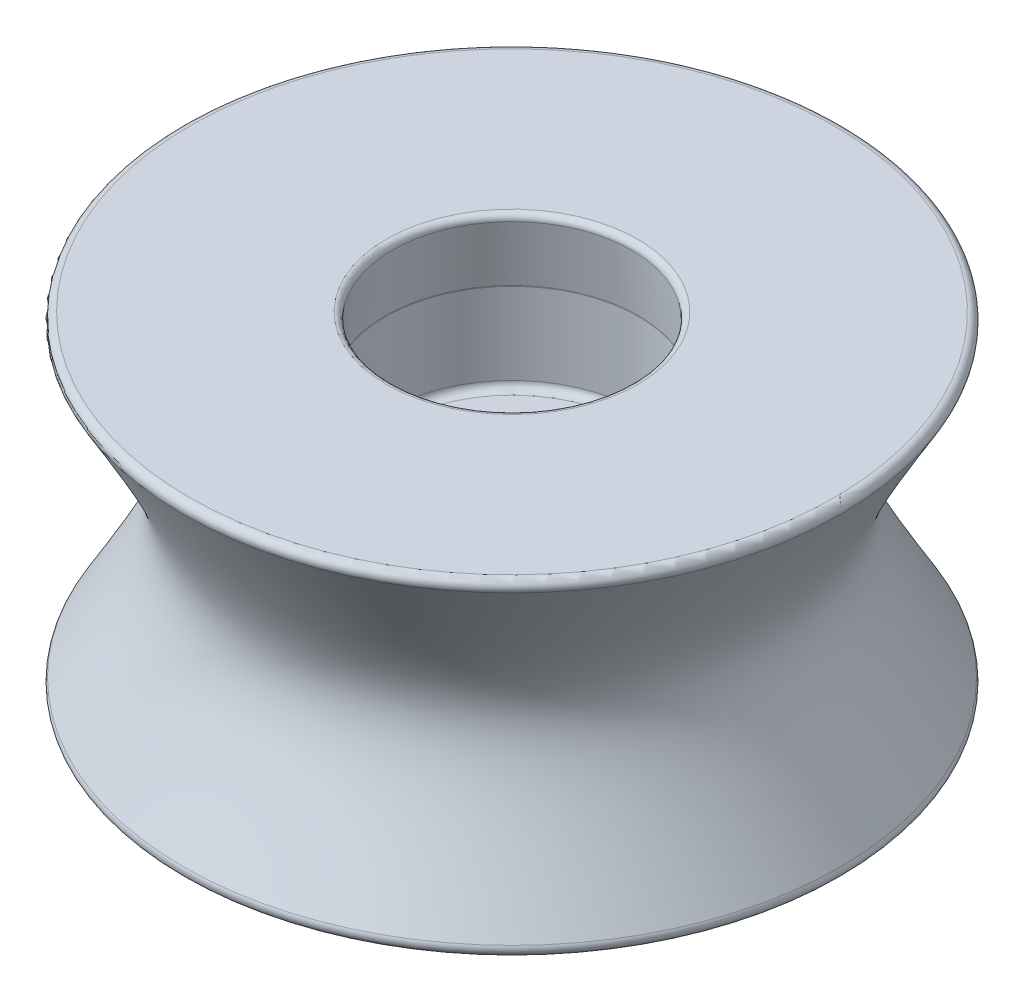
ISO-10303-21;
HEADER;
FILE_DESCRIPTION(('STEP AP214'),'2;1');
FILE_NAME('part.step','',(''),(''),'','','');
FILE_SCHEMA(('AUTOMOTIVE_DESIGN { 1 0 10303 214 1 1 1 1 }'));
ENDSEC;
DATA;
#1=APPLICATION_CONTEXT('core data for automotive mechanical design processes');
#2=APPLICATION_PROTOCOL_DEFINITION('international standard','automotive_design',2000,#1);
#3=PRODUCT_CONTEXT('',#1,'mechanical');
#4=PRODUCT('Part','Part','',(#3));
#5=PRODUCT_RELATED_PRODUCT_CATEGORY('part','',(#4));
#6=PRODUCT_DEFINITION_FORMATION('','',#4);
#7=PRODUCT_DEFINITION_CONTEXT('part definition',#1,'design');
#8=PRODUCT_DEFINITION('design','',#6,#7);
#9=PRODUCT_DEFINITION_SHAPE('','',#8);
#10=(LENGTH_UNIT() NAMED_UNIT(*) SI_UNIT(.MILLI.,.METRE.));
#11=(NAMED_UNIT(*) PLANE_ANGLE_UNIT() SI_UNIT($,.RADIAN.));
#12=(NAMED_UNIT(*) SI_UNIT($,.STERADIAN.) SOLID_ANGLE_UNIT());
#13=UNCERTAINTY_MEASURE_WITH_UNIT(LENGTH_MEASURE(1.E-05),#10,'distance_accuracy_value','');
#14=(GEOMETRIC_REPRESENTATION_CONTEXT(3) GLOBAL_UNCERTAINTY_ASSIGNED_CONTEXT((#13)) GLOBAL_UNIT_ASSIGNED_CONTEXT((#10,
#11,#12)) REPRESENTATION_CONTEXT('',''));
#15=CARTESIAN_POINT('',(0.,0.,0.));
#16=DIRECTION('',(0.,0.,1.));
#17=DIRECTION('',(1.,0.,0.));
#18=AXIS2_PLACEMENT_3D('',#15,#16,#17);
#19=CARTESIAN_POINT('',(0.,11.5,0.));
#20=DIRECTION('',(0.,1.,0.));
#21=DIRECTION('',(0.,0.,1.));
#22=AXIS2_PLACEMENT_3D('',#19,#20,#21);
#23=PLANE('',#22);
#24=CARTESIAN_POINT('',(0.,11.5,0.));
#25=DIRECTION('',(0.,1.,0.));
#26=DIRECTION('',(0.,0.,1.));
#27=AXIS2_PLACEMENT_3D('',#24,#25,#26);
#28=CIRCLE('',#27,4.5);
#29=CARTESIAN_POINT('',(0.,11.5,4.5));
#30=VERTEX_POINT('',#29);
#31=EDGE_CURVE('E73',#30,#30,#28,.F.);
#32=ORIENTED_EDGE('',*,*,#31,.T.);
#33=EDGE_LOOP('',(#32));
#34=FACE_BOUND('',#33,.T.);
#35=CARTESIAN_POINT('',(0.,11.5,0.));
#36=DIRECTION('',(0.,1.,0.));
#37=DIRECTION('',(0.,0.,1.));
#38=AXIS2_PLACEMENT_3D('',#35,#36,#37);
#39=CIRCLE('',#38,8.);
#40=CARTESIAN_POINT('',(0.,11.5,8.));
#41=VERTEX_POINT('',#40);
#42=EDGE_CURVE('E76',#41,#41,#39,.T.);
#43=ORIENTED_EDGE('',*,*,#42,.T.);
#44=EDGE_LOOP('',(#43));
#45=FACE_BOUND('',#44,.T.);
#46=ADVANCED_FACE('F35',(#34,#45),#23,.T.);
#47=CARTESIAN_POINT('',(0.,39.1304347826087,0.));
#48=DIRECTION('',(0.,1.,0.));
#49=DIRECTION('',(0.,0.,1.));
#50=AXIS2_PLACEMENT_3D('',#47,#48,#49);
#51=CYLINDRICAL_SURFACE('',#50,8.5);
#52=CARTESIAN_POINT('',(0.,12.,0.));
#53=DIRECTION('',(0.,1.,0.));
#54=DIRECTION('',(0.,0.,1.));
#55=AXIS2_PLACEMENT_3D('',#52,#53,#54);
#56=CIRCLE('',#55,8.5);
#57=CARTESIAN_POINT('',(0.,12.,8.5));
#58=VERTEX_POINT('',#57);
#59=EDGE_CURVE('E61',#58,#58,#56,.F.);
#60=ORIENTED_EDGE('',*,*,#59,.T.);
#61=EDGE_LOOP('',(#60));
#62=FACE_BOUND('',#61,.T.);
#63=CARTESIAN_POINT('',(0.,17.4723074309313,0.));
#64=DIRECTION('',(0.,1.,0.));
#65=DIRECTION('',(0.,0.,1.));
#66=AXIS2_PLACEMENT_3D('',#63,#64,#65);
#67=CIRCLE('',#66,8.5);
#68=CARTESIAN_POINT('',(0.,17.4723074309313,8.5));
#69=VERTEX_POINT('',#68);
#70=EDGE_CURVE('E64',#69,#69,#67,.T.);
#71=ORIENTED_EDGE('',*,*,#70,.T.);
#72=EDGE_LOOP('',(#71));
#73=FACE_BOUND('',#72,.T.);
#74=ADVANCED_FACE('F105',(#62,#73),#51,.F.);
#75=CARTESIAN_POINT('',(0.,17.5,0.));
#76=DIRECTION('',(0.,-1.,0.));
#77=DIRECTION('',(0.,0.,-1.));
#78=AXIS2_PLACEMENT_3D('',#75,#76,#77);
#79=CONICAL_SURFACE('',#78,8.5,0.110657221173896);
#80=CARTESIAN_POINT('',(0.,21.55582738957,0.));
#81=DIRECTION('',(0.,1.,0.));
#82=DIRECTION('',(0.,0.,1.));
#83=AXIS2_PLACEMENT_3D('',#80,#81,#82);
#84=CIRCLE('',#83,8.04935251226999);
#85=CARTESIAN_POINT('',(0.,21.55582738957,8.04935251226999));
#86=VERTEX_POINT('',#85);
#87=EDGE_CURVE('E42',#86,#86,#84,.T.);
#88=ORIENTED_EDGE('',*,*,#87,.T.);
#89=EDGE_LOOP('',(#88));
#90=FACE_BOUND('',#89,.T.);
#91=CARTESIAN_POINT('',(0.,17.5275231939687,0.));
#92=DIRECTION('',(0.,-1.,0.));
#93=DIRECTION('',(0.,0.,-1.));
#94=AXIS2_PLACEMENT_3D('',#91,#92,#93);
#95=CIRCLE('',#94,8.49694186733681);
#96=CARTESIAN_POINT('',(0.,17.5275231939687,-8.49694186733681));
#97=VERTEX_POINT('',#96);
#98=EDGE_CURVE('E58',#97,#97,#95,.T.);
#99=ORIENTED_EDGE('',*,*,#98,.T.);
#100=EDGE_LOOP('',(#99));
#101=FACE_BOUND('',#100,.T.);
#102=ADVANCED_FACE('F102',(#90,#101),#79,.F.);
#103=CARTESIAN_POINT('',(0.,22.,22.5));
#104=DIRECTION('',(0.,1.,0.));
#105=DIRECTION('',(0.,0.,1.));
#106=AXIS2_PLACEMENT_3D('',#103,#104,#105);
#107=PLANE('',#106);
#108=CARTESIAN_POINT('',(0.,22.,0.));
#109=DIRECTION('',(0.,1.,0.));
#110=DIRECTION('',(0.,0.,1.));
#111=AXIS2_PLACEMENT_3D('',#108,#109,#110);
#112=CIRCLE('',#111,8.44690600613944);
#113=CARTESIAN_POINT('',(0.,22.,8.44690600613944));
#114=VERTEX_POINT('',#113);
#115=EDGE_CURVE('E10',#114,#114,#112,.F.);
#116=ORIENTED_EDGE('',*,*,#115,.T.);
#117=EDGE_LOOP('',(#116));
#118=FACE_BOUND('',#117,.T.);
#119=CARTESIAN_POINT('',(0.,22.,0.));
#120=DIRECTION('',(0.,1.,0.));
#121=DIRECTION('',(0.,0.,1.));
#122=AXIS2_PLACEMENT_3D('',#119,#120,#121);
#123=CIRCLE('',#122,21.6251013683147);
#124=CARTESIAN_POINT('',(0.,22.,21.6251013683147));
#125=VERTEX_POINT('',#124);
#126=EDGE_CURVE('E46',#125,#125,#123,.T.);
#127=ORIENTED_EDGE('',*,*,#126,.T.);
#128=EDGE_LOOP('',(#127));
#129=FACE_BOUND('',#128,.T.);
#130=ADVANCED_FACE('F97',(#118,#129),#107,.T.);
#131=CARTESIAN_POINT('',(0.,22.,22.5));
#132=CARTESIAN_POINT('',(0.,11.,16.));
#133=CARTESIAN_POINT('',(0.,0.,22.5));
#134=(BOUNDED_CURVE() B_SPLINE_CURVE(2,(#131,#132,#133),.UNSPECIFIED.,.F.,
.F.) B_SPLINE_CURVE_WITH_KNOTS((3,3),(0.,1.),
.UNSPECIFIED.) CURVE() GEOMETRIC_REPRESENTATION_ITEM() RATIONAL_B_SPLINE_CURVE((1.,
3.50503053580487,1.)) REPRESENTATION_ITEM(''));
#135=CARTESIAN_POINT('',(0.,39.1304347826087,0.));
#136=DIRECTION('',(0.,1.,0.));
#137=AXIS1_PLACEMENT('',#135,#136);
#138=SURFACE_OF_REVOLUTION('',#134,#137);
#139=CARTESIAN_POINT('',(0.,0.75320314849172,0.));
#140=DIRECTION('',(0.,1.,0.));
#141=DIRECTION('',(0.,0.,1.));
#142=AXIS2_PLACEMENT_3D('',#139,#140,#141);
#143=CIRCLE('',#142,22.0562488669667);
#144=CARTESIAN_POINT('',(0.,0.75320314849172,22.0562488669667));
#145=VERTEX_POINT('',#144);
#146=EDGE_CURVE('E50',#145,#145,#143,.T.);
#147=ORIENTED_EDGE('',*,*,#146,.T.);
#148=EDGE_LOOP('',(#147));
#149=FACE_BOUND('',#148,.T.);
#150=CARTESIAN_POINT('',(0.,21.2467968515083,0.));
#151=DIRECTION('',(0.,1.,0.));
#152=DIRECTION('',(0.,0.,1.));
#153=AXIS2_PLACEMENT_3D('',#150,#151,#152);
#154=CIRCLE('',#153,22.0562488669667);
#155=CARTESIAN_POINT('',(0.,21.2467968515083,22.0562488669667));
#156=VERTEX_POINT('',#155);
#157=EDGE_CURVE('E55',#156,#156,#154,.F.);
#158=ORIENTED_EDGE('',*,*,#157,.T.);
#159=EDGE_LOOP('',(#158));
#160=FACE_BOUND('',#159,.T.);
#161=ADVANCED_FACE('F92',(#149,#160),#138,.F.);
#162=CARTESIAN_POINT('',(0.,0.,22.5));
#163=DIRECTION('',(0.,-1.,0.));
#164=DIRECTION('',(0.,0.,-1.));
#165=AXIS2_PLACEMENT_3D('',#162,#163,#164);
#166=PLANE('',#165);
#167=CARTESIAN_POINT('',(0.,0.,0.));
#168=DIRECTION('',(0.,-1.,0.));
#169=DIRECTION('',(0.,0.,-1.));
#170=AXIS2_PLACEMENT_3D('',#167,#168,#169);
#171=CIRCLE('',#170,4.5);
#172=CARTESIAN_POINT('',(0.,0.,-4.5));
#173=VERTEX_POINT('',#172);
#174=EDGE_CURVE('E67',#173,#173,#171,.F.);
#175=ORIENTED_EDGE('',*,*,#174,.T.);
#176=EDGE_LOOP('',(#175));
#177=FACE_BOUND('',#176,.T.);
#178=CARTESIAN_POINT('',(0.,0.,0.));
#179=DIRECTION('',(0.,-1.,0.));
#180=DIRECTION('',(0.,0.,-1.));
#181=AXIS2_PLACEMENT_3D('',#178,#179,#180);
#182=CIRCLE('',#181,21.6251013683147);
#183=CARTESIAN_POINT('',(0.,0.,-21.6251013683147));
#184=VERTEX_POINT('',#183);
#185=EDGE_CURVE('E70',#184,#184,#182,.T.);
#186=ORIENTED_EDGE('',*,*,#185,.T.);
#187=EDGE_LOOP('',(#186));
#188=FACE_BOUND('',#187,.T.);
#189=ADVANCED_FACE('F96',(#177,#188),#166,.T.);
#190=CARTESIAN_POINT('',(0.,22.,0.));
#191=DIRECTION('',(0.,-1.,0.));
#192=DIRECTION('',(0.,0.,-1.));
#193=AXIS2_PLACEMENT_3D('',#190,#191,#192);
#194=CYLINDRICAL_SURFACE('',#193,4.);
#195=CARTESIAN_POINT('',(0.,11.,0.));
#196=DIRECTION('',(0.,1.,0.));
#197=DIRECTION('',(0.,0.,1.));
#198=AXIS2_PLACEMENT_3D('',#195,#196,#197);
#199=CIRCLE('',#198,4.);
#200=CARTESIAN_POINT('',(0.,11.,4.));
#201=VERTEX_POINT('',#200);
#202=EDGE_CURVE('E79',#201,#201,#199,.T.);
#203=ORIENTED_EDGE('',*,*,#202,.T.);
#204=EDGE_LOOP('',(#203));
#205=FACE_BOUND('',#204,.T.);
#206=CARTESIAN_POINT('',(0.,0.499999999999997,0.));
#207=DIRECTION('',(0.,-1.,0.));
#208=DIRECTION('',(0.,0.,-1.));
#209=AXIS2_PLACEMENT_3D('',#206,#207,#208);
#210=CIRCLE('',#209,4.);
#211=CARTESIAN_POINT('',(0.,0.499999999999997,-4.));
#212=VERTEX_POINT('',#211);
#213=EDGE_CURVE('E82',#212,#212,#210,.T.);
#214=ORIENTED_EDGE('',*,*,#213,.T.);
#215=EDGE_LOOP('',(#214));
#216=FACE_BOUND('',#215,.T.);
#217=ADVANCED_FACE('F116',(#205,#216),#194,.F.);
#218=CARTESIAN_POINT('',(0.,11.,0.));
#219=DIRECTION('',(0.,1.,0.));
#220=DIRECTION('',(0.,0.,1.));
#221=AXIS2_PLACEMENT_3D('',#218,#219,#220);
#222=TOROIDAL_SURFACE('',#221,4.5,0.5);
#223=ORIENTED_EDGE('',*,*,#31,.F.);
#224=EDGE_LOOP('',(#223));
#225=FACE_BOUND('',#224,.T.);
#226=ORIENTED_EDGE('',*,*,#202,.F.);
#227=EDGE_LOOP('',(#226));
#228=FACE_BOUND('',#227,.T.);
#229=ADVANCED_FACE('F112',(#225,#228),#222,.T.);
#230=CARTESIAN_POINT('',(0.,0.499999999999997,0.));
#231=DIRECTION('',(0.,-1.,0.));
#232=DIRECTION('',(0.,0.,-1.));
#233=AXIS2_PLACEMENT_3D('',#230,#231,#232);
#234=TOROIDAL_SURFACE('',#233,4.5,0.5);
#235=ORIENTED_EDGE('',*,*,#174,.F.);
#236=EDGE_LOOP('',(#235));
#237=FACE_BOUND('',#236,.T.);
#238=ORIENTED_EDGE('',*,*,#213,.F.);
#239=EDGE_LOOP('',(#238));
#240=FACE_BOUND('',#239,.T.);
#241=ADVANCED_FACE('F115',(#237,#240),#234,.T.);
#242=CARTESIAN_POINT('',(0.,12.,0.));
#243=DIRECTION('',(0.,1.,0.));
#244=DIRECTION('',(0.,0.,1.));
#245=AXIS2_PLACEMENT_3D('',#242,#243,#244);
#246=TOROIDAL_SURFACE('',#245,8.,0.5);
#247=ORIENTED_EDGE('',*,*,#59,.F.);
#248=EDGE_LOOP('',(#247));
#249=FACE_BOUND('',#248,.T.);
#250=ORIENTED_EDGE('',*,*,#42,.F.);
#251=EDGE_LOOP('',(#250));
#252=FACE_BOUND('',#251,.T.);
#253=ADVANCED_FACE('F120',(#249,#252),#246,.F.);
#254=CARTESIAN_POINT('',(0.,17.4723074309313,0.));
#255=DIRECTION('',(0.,1.,0.));
#256=DIRECTION('',(0.,0.,1.));
#257=AXIS2_PLACEMENT_3D('',#254,#255,#256);
#258=TOROIDAL_SURFACE('',#257,8.,0.5);
#259=ORIENTED_EDGE('',*,*,#98,.F.);
#260=EDGE_LOOP('',(#259));
#261=FACE_BOUND('',#260,.T.);
#262=ORIENTED_EDGE('',*,*,#70,.F.);
#263=EDGE_LOOP('',(#262));
#264=FACE_BOUND('',#263,.T.);
#265=ADVANCED_FACE('F124',(#261,#264),#258,.F.);
#266=CARTESIAN_POINT('',(0.,0.499999999999994,0.));
#267=DIRECTION('',(0.,1.,0.));
#268=DIRECTION('',(0.,0.,1.));
#269=AXIS2_PLACEMENT_3D('',#266,#267,#268);
#270=TOROIDAL_SURFACE('',#269,21.6251013683147,0.5);
#271=ORIENTED_EDGE('',*,*,#185,.F.);
#272=EDGE_LOOP('',(#271));
#273=FACE_BOUND('',#272,.T.);
#274=ORIENTED_EDGE('',*,*,#146,.F.);
#275=EDGE_LOOP('',(#274));
#276=FACE_BOUND('',#275,.T.);
#277=ADVANCED_FACE('F128',(#273,#276),#270,.T.);
#278=CARTESIAN_POINT('',(0.,21.5,0.));
#279=DIRECTION('',(0.,1.,0.));
#280=DIRECTION('',(0.,0.,1.));
#281=AXIS2_PLACEMENT_3D('',#278,#279,#280);
#282=TOROIDAL_SURFACE('',#281,21.6251013683147,0.5);
#283=ORIENTED_EDGE('',*,*,#157,.F.);
#284=EDGE_LOOP('',(#283));
#285=FACE_BOUND('',#284,.T.);
#286=ORIENTED_EDGE('',*,*,#126,.F.);
#287=EDGE_LOOP('',(#286));
#288=FACE_BOUND('',#287,.T.);
#289=ADVANCED_FACE('F131',(#285,#288),#282,.T.);
#290=CARTESIAN_POINT('',(0.,21.6,0.));
#291=DIRECTION('',(0.,1.,0.));
#292=DIRECTION('',(0.,0.,1.));
#293=AXIS2_PLACEMENT_3D('',#290,#291,#292);
#294=TOROIDAL_SURFACE('',#293,8.44690600613944,0.4);
#295=ORIENTED_EDGE('',*,*,#115,.F.);
#296=EDGE_LOOP('',(#295));
#297=FACE_BOUND('',#296,.T.);
#298=ORIENTED_EDGE('',*,*,#87,.F.);
#299=EDGE_LOOP('',(#298));
#300=FACE_BOUND('',#299,.T.);
#301=ADVANCED_FACE('F37',(#297,#300),#294,.T.);
#302=CLOSED_SHELL('',(#46,#74,#102,#130,#161,#189,#217,#229,#241,#253,#265,#277,#289,#301));
#303=MANIFOLD_SOLID_BREP('B2',#302);
#304=ADVANCED_BREP_SHAPE_REPRESENTATION('',(#18,#303),#14);
#305=SHAPE_DEFINITION_REPRESENTATION(#9,#304);
ENDSEC;
END-ISO-10303-21;
